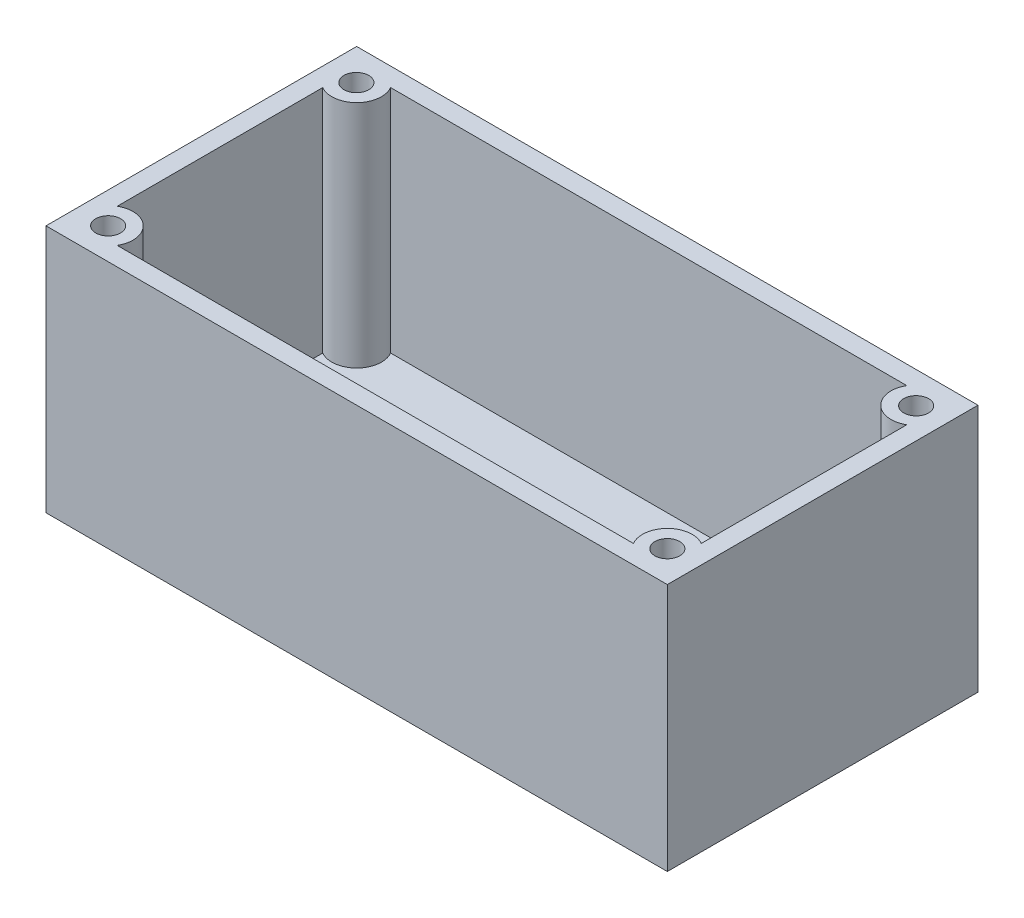
ISO-10303-21;
HEADER;
FILE_DESCRIPTION(('STEP AP214'),'2;1');
FILE_NAME('part.step','',(''),(''),'','','');
FILE_SCHEMA(('AUTOMOTIVE_DESIGN { 1 0 10303 214 1 1 1 1 }'));
ENDSEC;
DATA;
#1=APPLICATION_CONTEXT('core data for automotive mechanical design processes');
#2=APPLICATION_PROTOCOL_DEFINITION('international standard','automotive_design',2000,#1);
#3=PRODUCT_CONTEXT('',#1,'mechanical');
#4=PRODUCT('Part','Part','',(#3));
#5=PRODUCT_RELATED_PRODUCT_CATEGORY('part','',(#4));
#6=PRODUCT_DEFINITION_FORMATION('','',#4);
#7=PRODUCT_DEFINITION_CONTEXT('part definition',#1,'design');
#8=PRODUCT_DEFINITION('design','',#6,#7);
#9=PRODUCT_DEFINITION_SHAPE('','',#8);
#10=(LENGTH_UNIT() NAMED_UNIT(*) SI_UNIT(.MILLI.,.METRE.));
#11=(NAMED_UNIT(*) PLANE_ANGLE_UNIT() SI_UNIT($,.RADIAN.));
#12=(NAMED_UNIT(*) SI_UNIT($,.STERADIAN.) SOLID_ANGLE_UNIT());
#13=UNCERTAINTY_MEASURE_WITH_UNIT(LENGTH_MEASURE(1.E-05),#10,'distance_accuracy_value','');
#14=(GEOMETRIC_REPRESENTATION_CONTEXT(3) GLOBAL_UNCERTAINTY_ASSIGNED_CONTEXT((#13)) GLOBAL_UNIT_ASSIGNED_CONTEXT((#10,
#11,#12)) REPRESENTATION_CONTEXT('',''));
#15=CARTESIAN_POINT('',(0.,0.,0.));
#16=DIRECTION('',(0.,0.,1.));
#17=DIRECTION('',(1.,0.,0.));
#18=AXIS2_PLACEMENT_3D('',#15,#16,#17);
#19=CARTESIAN_POINT('',(0.,20.,-1.5));
#20=DIRECTION('',(0.,0.,-1.));
#21=DIRECTION('',(-1.,0.,0.));
#22=AXIS2_PLACEMENT_3D('',#19,#20,#21);
#23=PLANE('',#22);
#24=DIRECTION('',(1.,0.,0.));
#25=VECTOR('',#24,1.);
#26=CARTESIAN_POINT('',(0.,1.5,-1.5));
#27=LINE('',#26,#25);
#28=CARTESIAN_POINT('',(4.23205080756909,1.5,-1.5));
#29=VERTEX_POINT('',#28);
#30=CARTESIAN_POINT('',(45.7679491924313,1.5,-1.5));
#31=VERTEX_POINT('',#30);
#32=EDGE_CURVE('E251',#29,#31,#27,.T.);
#33=ORIENTED_EDGE('',*,*,#32,.F.);
#34=DIRECTION('',(0.,-1.,0.));
#35=VECTOR('',#34,1.);
#36=CARTESIAN_POINT('',(4.23205080756909,20.,-1.5));
#37=LINE('',#36,#35);
#38=CARTESIAN_POINT('',(4.23205080756909,20.,-1.5));
#39=VERTEX_POINT('',#38);
#40=EDGE_CURVE('E59',#29,#39,#37,.F.);
#41=ORIENTED_EDGE('',*,*,#40,.T.);
#42=DIRECTION('',(1.,0.,0.));
#43=VECTOR('',#42,1.);
#44=CARTESIAN_POINT('',(0.,20.,-1.5));
#45=LINE('',#44,#43);
#46=CARTESIAN_POINT('',(45.7679491924313,20.,-1.5));
#47=VERTEX_POINT('',#46);
#48=EDGE_CURVE('E264',#39,#47,#45,.T.);
#49=ORIENTED_EDGE('',*,*,#48,.T.);
#50=DIRECTION('',(0.,-1.,0.));
#51=VECTOR('',#50,1.);
#52=CARTESIAN_POINT('',(45.7679491924313,20.,-1.5));
#53=LINE('',#52,#51);
#54=EDGE_CURVE('E223',#47,#31,#53,.T.);
#55=ORIENTED_EDGE('',*,*,#54,.T.);
#56=EDGE_LOOP('',(#33,#41,#49,#55));
#57=FACE_BOUND('',#56,.T.);
#58=ADVANCED_FACE('F43',(#57),#23,.T.);
#59=CARTESIAN_POINT('',(1.5,20.,0.));
#60=DIRECTION('',(-1.,0.,0.));
#61=DIRECTION('',(0.,0.,1.));
#62=AXIS2_PLACEMENT_3D('',#59,#60,#61);
#63=PLANE('',#62);
#64=DIRECTION('',(0.,-1.,0.));
#65=VECTOR('',#64,1.);
#66=CARTESIAN_POINT('',(1.5,20.,-4.23205080756876));
#67=LINE('',#66,#65);
#68=CARTESIAN_POINT('',(1.5,1.5,-4.23205080756876));
#69=VERTEX_POINT('',#68);
#70=CARTESIAN_POINT('',(1.5,20.,-4.23205080756876));
#71=VERTEX_POINT('',#70);
#72=EDGE_CURVE('E214',#69,#71,#67,.F.);
#73=ORIENTED_EDGE('',*,*,#72,.F.);
#74=DIRECTION('',(0.,0.,-1.));
#75=VECTOR('',#74,1.);
#76=CARTESIAN_POINT('',(1.5,1.5,0.));
#77=LINE('',#76,#75);
#78=CARTESIAN_POINT('',(1.5,1.5,-20.7679491924311));
#79=VERTEX_POINT('',#78);
#80=EDGE_CURVE('E261',#69,#79,#77,.T.);
#81=ORIENTED_EDGE('',*,*,#80,.T.);
#82=DIRECTION('',(0.,-1.,0.));
#83=VECTOR('',#82,1.);
#84=CARTESIAN_POINT('',(1.5,20.,-20.7679491924311));
#85=LINE('',#84,#83);
#86=CARTESIAN_POINT('',(1.5,20.,-20.7679491924311));
#87=VERTEX_POINT('',#86);
#88=EDGE_CURVE('E244',#87,#79,#85,.T.);
#89=ORIENTED_EDGE('',*,*,#88,.F.);
#90=DIRECTION('',(0.,0.,-1.));
#91=VECTOR('',#90,1.);
#92=CARTESIAN_POINT('',(1.5,20.,0.));
#93=LINE('',#92,#91);
#94=EDGE_CURVE('E274',#71,#87,#93,.T.);
#95=ORIENTED_EDGE('',*,*,#94,.F.);
#96=EDGE_LOOP('',(#73,#81,#89,#95));
#97=FACE_BOUND('',#96,.T.);
#98=ADVANCED_FACE('F359',(#97),#63,.F.);
#99=CARTESIAN_POINT('',(48.5,20.,0.));
#100=DIRECTION('',(-1.,0.,0.));
#101=DIRECTION('',(0.,0.,1.));
#102=AXIS2_PLACEMENT_3D('',#99,#100,#101);
#103=PLANE('',#102);
#104=DIRECTION('',(0.,0.,-1.));
#105=VECTOR('',#104,1.);
#106=CARTESIAN_POINT('',(48.5,1.5,0.));
#107=LINE('',#106,#105);
#108=CARTESIAN_POINT('',(48.5,1.5,-4.232050807569));
#109=VERTEX_POINT('',#108);
#110=CARTESIAN_POINT('',(48.5,1.5,-20.7679491924311));
#111=VERTEX_POINT('',#110);
#112=EDGE_CURVE('E254',#109,#111,#107,.T.);
#113=ORIENTED_EDGE('',*,*,#112,.F.);
#114=DIRECTION('',(0.,-1.,0.));
#115=VECTOR('',#114,1.);
#116=CARTESIAN_POINT('',(48.5,20.,-4.232050807569));
#117=LINE('',#116,#115);
#118=CARTESIAN_POINT('',(48.5,20.,-4.232050807569));
#119=VERTEX_POINT('',#118);
#120=EDGE_CURVE('E66',#109,#119,#117,.F.);
#121=ORIENTED_EDGE('',*,*,#120,.T.);
#122=DIRECTION('',(0.,0.,-1.));
#123=VECTOR('',#122,1.);
#124=CARTESIAN_POINT('',(48.5,20.,0.));
#125=LINE('',#124,#123);
#126=CARTESIAN_POINT('',(48.5,20.,-20.7679491924311));
#127=VERTEX_POINT('',#126);
#128=EDGE_CURVE('E267',#119,#127,#125,.T.);
#129=ORIENTED_EDGE('',*,*,#128,.T.);
#130=DIRECTION('',(0.,-1.,0.));
#131=VECTOR('',#130,1.);
#132=CARTESIAN_POINT('',(48.5,20.,-20.7679491924311));
#133=LINE('',#132,#131);
#134=EDGE_CURVE('E233',#127,#111,#133,.T.);
#135=ORIENTED_EDGE('',*,*,#134,.T.);
#136=EDGE_LOOP('',(#113,#121,#129,#135));
#137=FACE_BOUND('',#136,.T.);
#138=ADVANCED_FACE('F337',(#137),#103,.T.);
#139=CARTESIAN_POINT('',(0.,20.,-23.5));
#140=DIRECTION('',(0.,0.,-1.));
#141=DIRECTION('',(-1.,0.,0.));
#142=AXIS2_PLACEMENT_3D('',#139,#140,#141);
#143=PLANE('',#142);
#144=DIRECTION('',(0.,-1.,0.));
#145=VECTOR('',#144,1.);
#146=CARTESIAN_POINT('',(45.7679491924311,20.,-23.5));
#147=LINE('',#146,#145);
#148=CARTESIAN_POINT('',(45.7679491924311,20.,-23.5));
#149=VERTEX_POINT('',#148);
#150=CARTESIAN_POINT('',(45.7679491924311,1.5,-23.5));
#151=VERTEX_POINT('',#150);
#152=EDGE_CURVE('E237',#149,#151,#147,.T.);
#153=ORIENTED_EDGE('',*,*,#152,.F.);
#154=DIRECTION('',(1.,0.,0.));
#155=VECTOR('',#154,1.);
#156=CARTESIAN_POINT('',(0.,20.,-23.5));
#157=LINE('',#156,#155);
#158=CARTESIAN_POINT('',(4.23205080756888,20.,-23.5));
#159=VERTEX_POINT('',#158);
#160=EDGE_CURVE('E270',#159,#149,#157,.T.);
#161=ORIENTED_EDGE('',*,*,#160,.F.);
#162=DIRECTION('',(0.,-1.,0.));
#163=VECTOR('',#162,1.);
#164=CARTESIAN_POINT('',(4.23205080756888,20.,-23.5));
#165=LINE('',#164,#163);
#166=CARTESIAN_POINT('',(4.23205080756888,1.5,-23.5));
#167=VERTEX_POINT('',#166);
#168=EDGE_CURVE('E248',#167,#159,#165,.F.);
#169=ORIENTED_EDGE('',*,*,#168,.F.);
#170=DIRECTION('',(1.,0.,0.));
#171=VECTOR('',#170,1.);
#172=CARTESIAN_POINT('',(0.,1.5,-23.5));
#173=LINE('',#172,#171);
#174=EDGE_CURVE('E257',#167,#151,#173,.T.);
#175=ORIENTED_EDGE('',*,*,#174,.T.);
#176=EDGE_LOOP('',(#153,#161,#169,#175));
#177=FACE_BOUND('',#176,.T.);
#178=ADVANCED_FACE('F351',(#177),#143,.F.);
#179=CARTESIAN_POINT('',(0.,20.,0.));
#180=DIRECTION('',(0.,0.,-1.));
#181=DIRECTION('',(-1.,0.,0.));
#182=AXIS2_PLACEMENT_3D('',#179,#180,#181);
#183=PLANE('',#182);
#184=DIRECTION('',(1.,0.,0.));
#185=VECTOR('',#184,1.);
#186=CARTESIAN_POINT('',(0.,0.,0.));
#187=LINE('',#186,#185);
#188=CARTESIAN_POINT('',(0.,0.,0.));
#189=VERTEX_POINT('',#188);
#190=CARTESIAN_POINT('',(50.,0.,0.));
#191=VERTEX_POINT('',#190);
#192=EDGE_CURVE('E277',#189,#191,#187,.T.);
#193=ORIENTED_EDGE('',*,*,#192,.T.);
#194=DIRECTION('',(0.,-1.,0.));
#195=VECTOR('',#194,1.);
#196=CARTESIAN_POINT('',(50.,20.,0.));
#197=LINE('',#196,#195);
#198=CARTESIAN_POINT('',(50.,20.,0.));
#199=VERTEX_POINT('',#198);
#200=EDGE_CURVE('E317',#199,#191,#197,.T.);
#201=ORIENTED_EDGE('',*,*,#200,.F.);
#202=DIRECTION('',(1.,0.,0.));
#203=VECTOR('',#202,1.);
#204=CARTESIAN_POINT('',(0.,20.,0.));
#205=LINE('',#204,#203);
#206=CARTESIAN_POINT('',(0.,20.,0.));
#207=VERTEX_POINT('',#206);
#208=EDGE_CURVE('E278',#207,#199,#205,.T.);
#209=ORIENTED_EDGE('',*,*,#208,.F.);
#210=DIRECTION('',(0.,-1.,0.));
#211=VECTOR('',#210,1.);
#212=CARTESIAN_POINT('',(0.,20.,0.));
#213=LINE('',#212,#211);
#214=EDGE_CURVE('E294',#207,#189,#213,.T.);
#215=ORIENTED_EDGE('',*,*,#214,.T.);
#216=EDGE_LOOP('',(#193,#201,#209,#215));
#217=FACE_BOUND('',#216,.T.);
#218=ADVANCED_FACE('F45',(#217),#183,.F.);
#219=CARTESIAN_POINT('',(50.,20.,0.));
#220=DIRECTION('',(-1.,0.,0.));
#221=DIRECTION('',(0.,0.,1.));
#222=AXIS2_PLACEMENT_3D('',#219,#220,#221);
#223=PLANE('',#222);
#224=DIRECTION('',(0.,0.,-1.));
#225=VECTOR('',#224,1.);
#226=CARTESIAN_POINT('',(50.,0.,0.));
#227=LINE('',#226,#225);
#228=CARTESIAN_POINT('',(50.,0.,-25.));
#229=VERTEX_POINT('',#228);
#230=EDGE_CURVE('E298',#191,#229,#227,.T.);
#231=ORIENTED_EDGE('',*,*,#230,.T.);
#232=DIRECTION('',(0.,-1.,0.));
#233=VECTOR('',#232,1.);
#234=CARTESIAN_POINT('',(50.,20.,-25.));
#235=LINE('',#234,#233);
#236=CARTESIAN_POINT('',(50.,20.,-25.));
#237=VERTEX_POINT('',#236);
#238=EDGE_CURVE('E314',#237,#229,#235,.T.);
#239=ORIENTED_EDGE('',*,*,#238,.F.);
#240=DIRECTION('',(0.,0.,-1.));
#241=VECTOR('',#240,1.);
#242=CARTESIAN_POINT('',(50.,20.,0.));
#243=LINE('',#242,#241);
#244=EDGE_CURVE('E282',#199,#237,#243,.T.);
#245=ORIENTED_EDGE('',*,*,#244,.F.);
#246=ORIENTED_EDGE('',*,*,#200,.T.);
#247=EDGE_LOOP('',(#231,#239,#245,#246));
#248=FACE_BOUND('',#247,.T.);
#249=ADVANCED_FACE('F399',(#248),#223,.F.);
#250=CARTESIAN_POINT('',(0.,20.,-25.));
#251=DIRECTION('',(0.,0.,-1.));
#252=DIRECTION('',(-1.,0.,0.));
#253=AXIS2_PLACEMENT_3D('',#250,#251,#252);
#254=PLANE('',#253);
#255=DIRECTION('',(1.,0.,0.));
#256=VECTOR('',#255,1.);
#257=CARTESIAN_POINT('',(0.,0.,-25.));
#258=LINE('',#257,#256);
#259=CARTESIAN_POINT('',(0.,0.,-25.));
#260=VERTEX_POINT('',#259);
#261=EDGE_CURVE('E302',#260,#229,#258,.T.);
#262=ORIENTED_EDGE('',*,*,#261,.F.);
#263=DIRECTION('',(0.,-1.,0.));
#264=VECTOR('',#263,1.);
#265=CARTESIAN_POINT('',(0.,20.,-25.));
#266=LINE('',#265,#264);
#267=CARTESIAN_POINT('',(0.,20.,-25.));
#268=VERTEX_POINT('',#267);
#269=EDGE_CURVE('E311',#268,#260,#266,.T.);
#270=ORIENTED_EDGE('',*,*,#269,.F.);
#271=DIRECTION('',(1.,0.,0.));
#272=VECTOR('',#271,1.);
#273=CARTESIAN_POINT('',(0.,20.,-25.));
#274=LINE('',#273,#272);
#275=EDGE_CURVE('E286',#268,#237,#274,.T.);
#276=ORIENTED_EDGE('',*,*,#275,.T.);
#277=ORIENTED_EDGE('',*,*,#238,.T.);
#278=EDGE_LOOP('',(#262,#270,#276,#277));
#279=FACE_BOUND('',#278,.T.);
#280=ADVANCED_FACE('F396',(#279),#254,.T.);
#281=CARTESIAN_POINT('',(0.,20.,0.));
#282=DIRECTION('',(-1.,0.,0.));
#283=DIRECTION('',(0.,0.,1.));
#284=AXIS2_PLACEMENT_3D('',#281,#282,#283);
#285=PLANE('',#284);
#286=DIRECTION('',(0.,0.,-1.));
#287=VECTOR('',#286,1.);
#288=CARTESIAN_POINT('',(0.,0.,0.));
#289=LINE('',#288,#287);
#290=EDGE_CURVE('E283',#189,#260,#289,.T.);
#291=ORIENTED_EDGE('',*,*,#290,.F.);
#292=ORIENTED_EDGE('',*,*,#214,.F.);
#293=DIRECTION('',(0.,0.,-1.));
#294=VECTOR('',#293,1.);
#295=CARTESIAN_POINT('',(0.,20.,0.));
#296=LINE('',#295,#294);
#297=EDGE_CURVE('E290',#207,#268,#296,.T.);
#298=ORIENTED_EDGE('',*,*,#297,.T.);
#299=ORIENTED_EDGE('',*,*,#269,.T.);
#300=EDGE_LOOP('',(#291,#292,#298,#299));
#301=FACE_BOUND('',#300,.T.);
#302=ADVANCED_FACE('F389',(#301),#285,.T.);
#303=CARTESIAN_POINT('',(0.,20.,0.));
#304=DIRECTION('',(0.,1.,0.));
#305=DIRECTION('',(0.,0.,1.));
#306=AXIS2_PLACEMENT_3D('',#303,#304,#305);
#307=PLANE('',#306);
#308=CARTESIAN_POINT('',(47.5532544339654,20.,-22.4717543760268));
#309=DIRECTION('',(0.,1.,0.));
#310=DIRECTION('',(0.,0.,1.));
#311=AXIS2_PLACEMENT_3D('',#308,#309,#310);
#312=CIRCLE('',#311,1.);
#313=CARTESIAN_POINT('',(47.5532544339654,20.,-21.4717543760268));
#314=VERTEX_POINT('',#313);
#315=EDGE_CURVE('E655',#314,#314,#312,.T.);
#316=ORIENTED_EDGE('',*,*,#315,.F.);
#317=EDGE_LOOP('',(#316));
#318=FACE_BOUND('',#317,.T.);
#319=CARTESIAN_POINT('',(47.5000000000002,20.,-2.5));
#320=DIRECTION('',(0.,1.,0.));
#321=DIRECTION('',(0.,0.,1.));
#322=AXIS2_PLACEMENT_3D('',#319,#320,#321);
#323=CIRCLE('',#322,1.);
#324=CARTESIAN_POINT('',(47.5000000000002,20.,-1.5));
#325=VERTEX_POINT('',#324);
#326=EDGE_CURVE('E154',#325,#325,#323,.T.);
#327=ORIENTED_EDGE('',*,*,#326,.F.);
#328=EDGE_LOOP('',(#327));
#329=FACE_BOUND('',#328,.T.);
#330=CARTESIAN_POINT('',(2.50364845205643,20.,-22.4717543760268));
#331=DIRECTION('',(0.,1.,0.));
#332=DIRECTION('',(0.,0.,1.));
#333=AXIS2_PLACEMENT_3D('',#330,#331,#332);
#334=CIRCLE('',#333,1.);
#335=CARTESIAN_POINT('',(2.50364845205643,20.,-21.4717543760268));
#336=VERTEX_POINT('',#335);
#337=EDGE_CURVE('E178',#336,#336,#334,.T.);
#338=ORIENTED_EDGE('',*,*,#337,.F.);
#339=EDGE_LOOP('',(#338));
#340=FACE_BOUND('',#339,.T.);
#341=CARTESIAN_POINT('',(2.50000000000021,20.,-2.5));
#342=DIRECTION('',(0.,1.,0.));
#343=DIRECTION('',(0.,0.,1.));
#344=AXIS2_PLACEMENT_3D('',#341,#342,#343);
#345=CIRCLE('',#344,1.);
#346=CARTESIAN_POINT('',(2.50000000000021,20.,-1.5));
#347=VERTEX_POINT('',#346);
#348=EDGE_CURVE('E194',#347,#347,#345,.T.);
#349=ORIENTED_EDGE('',*,*,#348,.F.);
#350=EDGE_LOOP('',(#349));
#351=FACE_BOUND('',#350,.T.);
#352=ORIENTED_EDGE('',*,*,#48,.F.);
#353=CARTESIAN_POINT('',(2.50000000000021,20.,-2.5));
#354=DIRECTION('',(0.,1.,0.));
#355=DIRECTION('',(0.,0.,1.));
#356=AXIS2_PLACEMENT_3D('',#353,#354,#355);
#357=CIRCLE('',#356,2.);
#358=EDGE_CURVE('E210',#39,#71,#357,.T.);
#359=ORIENTED_EDGE('',*,*,#358,.T.);
#360=ORIENTED_EDGE('',*,*,#94,.T.);
#361=CARTESIAN_POINT('',(2.5,20.,-22.5));
#362=DIRECTION('',(0.,1.,0.));
#363=DIRECTION('',(0.,0.,1.));
#364=AXIS2_PLACEMENT_3D('',#361,#362,#363);
#365=CIRCLE('',#364,2.);
#366=EDGE_CURVE('E240',#87,#159,#365,.T.);
#367=ORIENTED_EDGE('',*,*,#366,.T.);
#368=ORIENTED_EDGE('',*,*,#160,.T.);
#369=CARTESIAN_POINT('',(47.5,20.,-22.5));
#370=DIRECTION('',(0.,1.,0.));
#371=DIRECTION('',(0.,0.,1.));
#372=AXIS2_PLACEMENT_3D('',#369,#370,#371);
#373=CIRCLE('',#372,2.);
#374=EDGE_CURVE('E229',#149,#127,#373,.T.);
#375=ORIENTED_EDGE('',*,*,#374,.T.);
#376=ORIENTED_EDGE('',*,*,#128,.F.);
#377=CARTESIAN_POINT('',(47.5000000000002,20.,-2.5));
#378=DIRECTION('',(0.,1.,0.));
#379=DIRECTION('',(0.,0.,1.));
#380=AXIS2_PLACEMENT_3D('',#377,#378,#379);
#381=CIRCLE('',#380,2.);
#382=EDGE_CURVE('E219',#119,#47,#381,.T.);
#383=ORIENTED_EDGE('',*,*,#382,.T.);
#384=EDGE_LOOP('',(#352,#359,#360,#367,#368,#375,#376,#383));
#385=FACE_BOUND('',#384,.T.);
#386=ORIENTED_EDGE('',*,*,#208,.T.);
#387=ORIENTED_EDGE('',*,*,#244,.T.);
#388=ORIENTED_EDGE('',*,*,#275,.F.);
#389=ORIENTED_EDGE('',*,*,#297,.F.);
#390=EDGE_LOOP('',(#386,#387,#388,#389));
#391=FACE_BOUND('',#390,.T.);
#392=ADVANCED_FACE('F345',(#318,#329,#340,#351,#385,#391),#307,.T.);
#393=CARTESIAN_POINT('',(0.,0.,0.));
#394=DIRECTION('',(0.,1.,0.));
#395=DIRECTION('',(0.,0.,1.));
#396=AXIS2_PLACEMENT_3D('',#393,#394,#395);
#397=PLANE('',#396);
#398=ORIENTED_EDGE('',*,*,#192,.F.);
#399=ORIENTED_EDGE('',*,*,#290,.T.);
#400=ORIENTED_EDGE('',*,*,#261,.T.);
#401=ORIENTED_EDGE('',*,*,#230,.F.);
#402=EDGE_LOOP('',(#398,#399,#400,#401));
#403=FACE_BOUND('',#402,.T.);
#404=ADVANCED_FACE('F386',(#403),#397,.F.);
#405=CARTESIAN_POINT('',(0.,1.5,0.));
#406=DIRECTION('',(0.,1.,0.));
#407=DIRECTION('',(0.,0.,1.));
#408=AXIS2_PLACEMENT_3D('',#405,#406,#407);
#409=PLANE('',#408);
#410=ORIENTED_EDGE('',*,*,#80,.F.);
#411=CARTESIAN_POINT('',(2.50000000000021,1.5,-2.5));
#412=DIRECTION('',(0.,1.,0.));
#413=DIRECTION('',(0.,0.,1.));
#414=AXIS2_PLACEMENT_3D('',#411,#412,#413);
#415=CIRCLE('',#414,2.);
#416=EDGE_CURVE('E11',#69,#29,#415,.F.);
#417=ORIENTED_EDGE('',*,*,#416,.T.);
#418=ORIENTED_EDGE('',*,*,#32,.T.);
#419=CARTESIAN_POINT('',(47.5000000000002,1.5,-2.5));
#420=DIRECTION('',(0.,1.,0.));
#421=DIRECTION('',(0.,0.,1.));
#422=AXIS2_PLACEMENT_3D('',#419,#420,#421);
#423=CIRCLE('',#422,2.);
#424=EDGE_CURVE('E52',#31,#109,#423,.F.);
#425=ORIENTED_EDGE('',*,*,#424,.T.);
#426=ORIENTED_EDGE('',*,*,#112,.T.);
#427=CARTESIAN_POINT('',(47.5,1.5,-22.5));
#428=DIRECTION('',(0.,1.,0.));
#429=DIRECTION('',(0.,0.,1.));
#430=AXIS2_PLACEMENT_3D('',#427,#428,#429);
#431=CIRCLE('',#430,2.);
#432=EDGE_CURVE('E325',#111,#151,#431,.F.);
#433=ORIENTED_EDGE('',*,*,#432,.T.);
#434=ORIENTED_EDGE('',*,*,#174,.F.);
#435=CARTESIAN_POINT('',(2.5,1.5,-22.5));
#436=DIRECTION('',(0.,1.,0.));
#437=DIRECTION('',(0.,0.,1.));
#438=AXIS2_PLACEMENT_3D('',#435,#436,#437);
#439=CIRCLE('',#438,2.);
#440=EDGE_CURVE('E321',#167,#79,#439,.F.);
#441=ORIENTED_EDGE('',*,*,#440,.T.);
#442=EDGE_LOOP('',(#410,#417,#418,#425,#426,#433,#434,#441));
#443=FACE_BOUND('',#442,.T.);
#444=ADVANCED_FACE('F332',(#443),#409,.T.);
#445=CARTESIAN_POINT('',(2.5,20.,-22.5));
#446=DIRECTION('',(0.,-1.,0.));
#447=DIRECTION('',(0.,0.,-1.));
#448=AXIS2_PLACEMENT_3D('',#445,#446,#447);
#449=CYLINDRICAL_SURFACE('',#448,2.);
#450=ORIENTED_EDGE('',*,*,#440,.F.);
#451=ORIENTED_EDGE('',*,*,#168,.T.);
#452=ORIENTED_EDGE('',*,*,#366,.F.);
#453=ORIENTED_EDGE('',*,*,#88,.T.);
#454=EDGE_LOOP('',(#450,#451,#452,#453));
#455=FACE_BOUND('',#454,.T.);
#456=ADVANCED_FACE('F354',(#455),#449,.T.);
#457=CARTESIAN_POINT('',(47.5,20.,-22.5));
#458=DIRECTION('',(0.,-1.,0.));
#459=DIRECTION('',(0.,0.,-1.));
#460=AXIS2_PLACEMENT_3D('',#457,#458,#459);
#461=CYLINDRICAL_SURFACE('',#460,2.);
#462=ORIENTED_EDGE('',*,*,#374,.F.);
#463=ORIENTED_EDGE('',*,*,#152,.T.);
#464=ORIENTED_EDGE('',*,*,#432,.F.);
#465=ORIENTED_EDGE('',*,*,#134,.F.);
#466=EDGE_LOOP('',(#462,#463,#464,#465));
#467=FACE_BOUND('',#466,.T.);
#468=ADVANCED_FACE('F341',(#467),#461,.T.);
#469=CARTESIAN_POINT('',(47.5000000000002,20.,-2.5));
#470=DIRECTION('',(0.,-1.,0.));
#471=DIRECTION('',(0.,0.,-1.));
#472=AXIS2_PLACEMENT_3D('',#469,#470,#471);
#473=CYLINDRICAL_SURFACE('',#472,2.);
#474=ORIENTED_EDGE('',*,*,#120,.F.);
#475=ORIENTED_EDGE('',*,*,#424,.F.);
#476=ORIENTED_EDGE('',*,*,#54,.F.);
#477=ORIENTED_EDGE('',*,*,#382,.F.);
#478=EDGE_LOOP('',(#474,#475,#476,#477));
#479=FACE_BOUND('',#478,.T.);
#480=ADVANCED_FACE('F362',(#479),#473,.T.);
#481=CARTESIAN_POINT('',(2.50000000000021,20.,-2.5));
#482=DIRECTION('',(0.,-1.,0.));
#483=DIRECTION('',(0.,0.,-1.));
#484=AXIS2_PLACEMENT_3D('',#481,#482,#483);
#485=CYLINDRICAL_SURFACE('',#484,2.);
#486=ORIENTED_EDGE('',*,*,#40,.F.);
#487=ORIENTED_EDGE('',*,*,#416,.F.);
#488=ORIENTED_EDGE('',*,*,#72,.T.);
#489=ORIENTED_EDGE('',*,*,#358,.F.);
#490=EDGE_LOOP('',(#486,#487,#488,#489));
#491=FACE_BOUND('',#490,.T.);
#492=ADVANCED_FACE('F360',(#491),#485,.T.);
#493=CARTESIAN_POINT('',(2.50000000000021,12.,-2.5));
#494=DIRECTION('',(0.,1.,0.));
#495=DIRECTION('',(0.,0.,1.));
#496=AXIS2_PLACEMENT_3D('',#493,#494,#495);
#497=CONICAL_SURFACE('',#496,0.799999999999998,1.02974425867665);
#498=CARTESIAN_POINT('',(2.50000000000021,11.519311504778,-2.5));
#499=VERTEX_POINT('',#498);
#500=VERTEX_LOOP('',#499);
#501=FACE_BOUND('',#500,.T.);
#502=CARTESIAN_POINT('',(2.50000000000021,12.,-2.5));
#503=DIRECTION('',(0.,1.,0.));
#504=DIRECTION('',(0.,0.,1.));
#505=AXIS2_PLACEMENT_3D('',#502,#503,#504);
#506=CIRCLE('',#505,0.799999999999998);
#507=CARTESIAN_POINT('',(2.50000000000021,12.,-1.7));
#508=VERTEX_POINT('',#507);
#509=EDGE_CURVE('E206',#508,#508,#506,.T.);
#510=ORIENTED_EDGE('',*,*,#509,.T.);
#511=EDGE_LOOP('',(#510));
#512=FACE_BOUND('',#511,.T.);
#513=ADVANCED_FACE('F369',(#501,#512),#497,.F.);
#514=CARTESIAN_POINT('',(2.50000000000021,20.,-2.5));
#515=DIRECTION('',(0.,1.,0.));
#516=DIRECTION('',(0.,0.,1.));
#517=AXIS2_PLACEMENT_3D('',#514,#515,#516);
#518=CYLINDRICAL_SURFACE('',#517,0.799999999999998);
#519=ORIENTED_EDGE('',*,*,#509,.F.);
#520=EDGE_LOOP('',(#519));
#521=FACE_BOUND('',#520,.T.);
#522=CARTESIAN_POINT('',(2.50000000000021,16.,-2.5));
#523=DIRECTION('',(0.,1.,0.));
#524=DIRECTION('',(0.,0.,1.));
#525=AXIS2_PLACEMENT_3D('',#522,#523,#524);
#526=CIRCLE('',#525,0.799999999999999);
#527=CARTESIAN_POINT('',(2.50000000000021,16.,-1.7));
#528=VERTEX_POINT('',#527);
#529=EDGE_CURVE('E202',#528,#528,#526,.T.);
#530=ORIENTED_EDGE('',*,*,#529,.T.);
#531=EDGE_LOOP('',(#530));
#532=FACE_BOUND('',#531,.T.);
#533=ADVANCED_FACE('F495',(#521,#532),#518,.F.);
#534=CARTESIAN_POINT('',(3.30000000000021,16.,-2.5));
#535=DIRECTION('',(0.,-1.,0.));
#536=DIRECTION('',(0.,0.,-1.));
#537=AXIS2_PLACEMENT_3D('',#534,#535,#536);
#538=PLANE('',#537);
#539=ORIENTED_EDGE('',*,*,#529,.F.);
#540=EDGE_LOOP('',(#539));
#541=FACE_BOUND('',#540,.T.);
#542=CARTESIAN_POINT('',(2.50000000000021,16.,-2.5));
#543=DIRECTION('',(0.,1.,0.));
#544=DIRECTION('',(0.,0.,1.));
#545=AXIS2_PLACEMENT_3D('',#542,#543,#544);
#546=CIRCLE('',#545,0.999999999999999);
#547=CARTESIAN_POINT('',(2.50000000000021,16.,-1.5));
#548=VERTEX_POINT('',#547);
#549=EDGE_CURVE('E198',#548,#548,#546,.T.);
#550=ORIENTED_EDGE('',*,*,#549,.T.);
#551=EDGE_LOOP('',(#550));
#552=FACE_BOUND('',#551,.T.);
#553=ADVANCED_FACE('F502',(#541,#552),#538,.F.);
#554=CARTESIAN_POINT('',(2.50000000000021,20.,-2.5));
#555=DIRECTION('',(0.,1.,0.));
#556=DIRECTION('',(0.,0.,1.));
#557=AXIS2_PLACEMENT_3D('',#554,#555,#556);
#558=CYLINDRICAL_SURFACE('',#557,0.999999999999999);
#559=ORIENTED_EDGE('',*,*,#549,.F.);
#560=EDGE_LOOP('',(#559));
#561=FACE_BOUND('',#560,.T.);
#562=ORIENTED_EDGE('',*,*,#348,.T.);
#563=EDGE_LOOP('',(#562));
#564=FACE_BOUND('',#563,.T.);
#565=ADVANCED_FACE('F510',(#561,#564),#558,.F.);
#566=CARTESIAN_POINT('',(2.50364845205643,12.,-22.4717543760268));
#567=DIRECTION('',(0.,1.,0.));
#568=DIRECTION('',(0.,0.,1.));
#569=AXIS2_PLACEMENT_3D('',#566,#567,#568);
#570=CONICAL_SURFACE('',#569,0.799999999999998,1.02974425867665);
#571=CARTESIAN_POINT('',(2.50364845205643,11.519311504778,-22.4717543760268));
#572=VERTEX_POINT('',#571);
#573=VERTEX_LOOP('',#572);
#574=FACE_BOUND('',#573,.T.);
#575=CARTESIAN_POINT('',(2.50364845205643,12.,-22.4717543760268));
#576=DIRECTION('',(0.,1.,0.));
#577=DIRECTION('',(0.,0.,1.));
#578=AXIS2_PLACEMENT_3D('',#575,#576,#577);
#579=CIRCLE('',#578,0.799999999999998);
#580=CARTESIAN_POINT('',(2.50364845205643,12.,-21.6717543760268));
#581=VERTEX_POINT('',#580);
#582=EDGE_CURVE('E190',#581,#581,#579,.T.);
#583=ORIENTED_EDGE('',*,*,#582,.T.);
#584=EDGE_LOOP('',(#583));
#585=FACE_BOUND('',#584,.T.);
#586=ADVANCED_FACE('F519',(#574,#585),#570,.F.);
#587=CARTESIAN_POINT('',(2.50364845205643,20.,-22.4717543760268));
#588=DIRECTION('',(0.,1.,0.));
#589=DIRECTION('',(0.,0.,1.));
#590=AXIS2_PLACEMENT_3D('',#587,#588,#589);
#591=CYLINDRICAL_SURFACE('',#590,0.799999999999998);
#592=ORIENTED_EDGE('',*,*,#582,.F.);
#593=EDGE_LOOP('',(#592));
#594=FACE_BOUND('',#593,.T.);
#595=CARTESIAN_POINT('',(2.50364845205643,16.,-22.4717543760268));
#596=DIRECTION('',(0.,1.,0.));
#597=DIRECTION('',(0.,0.,1.));
#598=AXIS2_PLACEMENT_3D('',#595,#596,#597);
#599=CIRCLE('',#598,0.799999999999999);
#600=CARTESIAN_POINT('',(2.50364845205643,16.,-21.6717543760268));
#601=VERTEX_POINT('',#600);
#602=EDGE_CURVE('E186',#601,#601,#599,.T.);
#603=ORIENTED_EDGE('',*,*,#602,.T.);
#604=EDGE_LOOP('',(#603));
#605=FACE_BOUND('',#604,.T.);
#606=ADVANCED_FACE('F527',(#594,#605),#591,.F.);
#607=CARTESIAN_POINT('',(3.30364845205643,16.,-22.4717543760268));
#608=DIRECTION('',(0.,-1.,0.));
#609=DIRECTION('',(0.,0.,-1.));
#610=AXIS2_PLACEMENT_3D('',#607,#608,#609);
#611=PLANE('',#610);
#612=ORIENTED_EDGE('',*,*,#602,.F.);
#613=EDGE_LOOP('',(#612));
#614=FACE_BOUND('',#613,.T.);
#615=CARTESIAN_POINT('',(2.50364845205643,16.,-22.4717543760268));
#616=DIRECTION('',(0.,1.,0.));
#617=DIRECTION('',(0.,0.,1.));
#618=AXIS2_PLACEMENT_3D('',#615,#616,#617);
#619=CIRCLE('',#618,0.999999999999999);
#620=CARTESIAN_POINT('',(2.50364845205643,16.,-21.4717543760268));
#621=VERTEX_POINT('',#620);
#622=EDGE_CURVE('E182',#621,#621,#619,.T.);
#623=ORIENTED_EDGE('',*,*,#622,.T.);
#624=EDGE_LOOP('',(#623));
#625=FACE_BOUND('',#624,.T.);
#626=ADVANCED_FACE('F535',(#614,#625),#611,.F.);
#627=CARTESIAN_POINT('',(2.50364845205643,20.,-22.4717543760268));
#628=DIRECTION('',(0.,1.,0.));
#629=DIRECTION('',(0.,0.,1.));
#630=AXIS2_PLACEMENT_3D('',#627,#628,#629);
#631=CYLINDRICAL_SURFACE('',#630,0.999999999999999);
#632=ORIENTED_EDGE('',*,*,#622,.F.);
#633=EDGE_LOOP('',(#632));
#634=FACE_BOUND('',#633,.T.);
#635=ORIENTED_EDGE('',*,*,#337,.T.);
#636=EDGE_LOOP('',(#635));
#637=FACE_BOUND('',#636,.T.);
#638=ADVANCED_FACE('F543',(#634,#637),#631,.F.);
#639=CARTESIAN_POINT('',(47.5000000000002,12.,-2.5));
#640=DIRECTION('',(0.,1.,0.));
#641=DIRECTION('',(0.,0.,1.));
#642=AXIS2_PLACEMENT_3D('',#639,#640,#641);
#643=CONICAL_SURFACE('',#642,0.799999999999995,1.02974425867665);
#644=CARTESIAN_POINT('',(47.5000000000002,11.519311504778,-2.5));
#645=VERTEX_POINT('',#644);
#646=VERTEX_LOOP('',#645);
#647=FACE_BOUND('',#646,.T.);
#648=CARTESIAN_POINT('',(47.5000000000002,12.,-2.5));
#649=DIRECTION('',(0.,1.,0.));
#650=DIRECTION('',(0.,0.,1.));
#651=AXIS2_PLACEMENT_3D('',#648,#649,#650);
#652=CIRCLE('',#651,0.799999999999995);
#653=CARTESIAN_POINT('',(47.5000000000002,12.,-1.70000000000001));
#654=VERTEX_POINT('',#653);
#655=EDGE_CURVE('E174',#654,#654,#652,.T.);
#656=ORIENTED_EDGE('',*,*,#655,.T.);
#657=EDGE_LOOP('',(#656));
#658=FACE_BOUND('',#657,.T.);
#659=ADVANCED_FACE('F551',(#647,#658),#643,.F.);
#660=CARTESIAN_POINT('',(47.5000000000002,20.,-2.5));
#661=DIRECTION('',(0.,1.,0.));
#662=DIRECTION('',(0.,0.,1.));
#663=AXIS2_PLACEMENT_3D('',#660,#661,#662);
#664=CYLINDRICAL_SURFACE('',#663,0.799999999999995);
#665=ORIENTED_EDGE('',*,*,#655,.F.);
#666=EDGE_LOOP('',(#665));
#667=FACE_BOUND('',#666,.T.);
#668=CARTESIAN_POINT('',(47.5000000000002,16.,-2.5));
#669=DIRECTION('',(0.,1.,0.));
#670=DIRECTION('',(0.,0.,1.));
#671=AXIS2_PLACEMENT_3D('',#668,#669,#670);
#672=CIRCLE('',#671,0.799999999999995);
#673=CARTESIAN_POINT('',(47.5000000000002,16.,-1.70000000000001));
#674=VERTEX_POINT('',#673);
#675=EDGE_CURVE('E170',#674,#674,#672,.T.);
#676=ORIENTED_EDGE('',*,*,#675,.T.);
#677=EDGE_LOOP('',(#676));
#678=FACE_BOUND('',#677,.T.);
#679=ADVANCED_FACE('F559',(#667,#678),#664,.F.);
#680=CARTESIAN_POINT('',(48.3000000000002,16.,-2.5));
#681=DIRECTION('',(0.,-1.,0.));
#682=DIRECTION('',(0.,0.,-1.));
#683=AXIS2_PLACEMENT_3D('',#680,#681,#682);
#684=PLANE('',#683);
#685=ORIENTED_EDGE('',*,*,#675,.F.);
#686=EDGE_LOOP('',(#685));
#687=FACE_BOUND('',#686,.T.);
#688=CARTESIAN_POINT('',(47.5000000000002,16.,-2.5));
#689=DIRECTION('',(0.,1.,0.));
#690=DIRECTION('',(0.,0.,1.));
#691=AXIS2_PLACEMENT_3D('',#688,#689,#690);
#692=CIRCLE('',#691,1.);
#693=CARTESIAN_POINT('',(47.5000000000002,16.,-1.5));
#694=VERTEX_POINT('',#693);
#695=EDGE_CURVE('E160',#694,#694,#692,.T.);
#696=ORIENTED_EDGE('',*,*,#695,.T.);
#697=EDGE_LOOP('',(#696));
#698=FACE_BOUND('',#697,.T.);
#699=ADVANCED_FACE('F567',(#687,#698),#684,.F.);
#700=CARTESIAN_POINT('',(47.5000000000002,20.,-2.5));
#701=DIRECTION('',(0.,1.,0.));
#702=DIRECTION('',(0.,0.,1.));
#703=AXIS2_PLACEMENT_3D('',#700,#701,#702);
#704=CYLINDRICAL_SURFACE('',#703,1.);
#705=ORIENTED_EDGE('',*,*,#695,.F.);
#706=EDGE_LOOP('',(#705));
#707=FACE_BOUND('',#706,.T.);
#708=ORIENTED_EDGE('',*,*,#326,.T.);
#709=EDGE_LOOP('',(#708));
#710=FACE_BOUND('',#709,.T.);
#711=ADVANCED_FACE('F147',(#707,#710),#704,.F.);
#712=CARTESIAN_POINT('',(47.5532544339654,12.,-22.4717543760268));
#713=DIRECTION('',(0.,1.,0.));
#714=DIRECTION('',(0.,0.,1.));
#715=AXIS2_PLACEMENT_3D('',#712,#713,#714);
#716=CONICAL_SURFACE('',#715,0.799999999999995,1.02974425867665);
#717=CARTESIAN_POINT('',(47.5532544339654,11.519311504778,-22.4717543760268));
#718=VERTEX_POINT('',#717);
#719=VERTEX_LOOP('',#718);
#720=FACE_BOUND('',#719,.T.);
#721=CARTESIAN_POINT('',(47.5532544339654,12.,-22.4717543760268));
#722=DIRECTION('',(0.,1.,0.));
#723=DIRECTION('',(0.,0.,1.));
#724=AXIS2_PLACEMENT_3D('',#721,#722,#723);
#725=CIRCLE('',#724,0.799999999999995);
#726=CARTESIAN_POINT('',(47.5532544339654,12.,-21.6717543760268));
#727=VERTEX_POINT('',#726);
#728=EDGE_CURVE('E151',#727,#727,#725,.T.);
#729=ORIENTED_EDGE('',*,*,#728,.T.);
#730=EDGE_LOOP('',(#729));
#731=FACE_BOUND('',#730,.T.);
#732=ADVANCED_FACE('F143',(#720,#731),#716,.F.);
#733=CARTESIAN_POINT('',(47.5532544339654,20.,-22.4717543760268));
#734=DIRECTION('',(0.,1.,0.));
#735=DIRECTION('',(0.,0.,1.));
#736=AXIS2_PLACEMENT_3D('',#733,#734,#735);
#737=CYLINDRICAL_SURFACE('',#736,0.799999999999995);
#738=ORIENTED_EDGE('',*,*,#728,.F.);
#739=EDGE_LOOP('',(#738));
#740=FACE_BOUND('',#739,.T.);
#741=CARTESIAN_POINT('',(47.5532544339654,16.,-22.4717543760268));
#742=DIRECTION('',(0.,1.,0.));
#743=DIRECTION('',(0.,0.,1.));
#744=AXIS2_PLACEMENT_3D('',#741,#742,#743);
#745=CIRCLE('',#744,0.799999999999995);
#746=CARTESIAN_POINT('',(47.5532544339654,16.,-21.6717543760268));
#747=VERTEX_POINT('',#746);
#748=EDGE_CURVE('E155',#747,#747,#745,.T.);
#749=ORIENTED_EDGE('',*,*,#748,.T.);
#750=EDGE_LOOP('',(#749));
#751=FACE_BOUND('',#750,.T.);
#752=ADVANCED_FACE('F146',(#740,#751),#737,.F.);
#753=CARTESIAN_POINT('',(48.3532544339654,16.,-22.4717543760268));
#754=DIRECTION('',(0.,-1.,0.));
#755=DIRECTION('',(0.,0.,-1.));
#756=AXIS2_PLACEMENT_3D('',#753,#754,#755);
#757=PLANE('',#756);
#758=ORIENTED_EDGE('',*,*,#748,.F.);
#759=EDGE_LOOP('',(#758));
#760=FACE_BOUND('',#759,.T.);
#761=CARTESIAN_POINT('',(47.5532544339654,16.,-22.4717543760268));
#762=DIRECTION('',(0.,1.,0.));
#763=DIRECTION('',(0.,0.,1.));
#764=AXIS2_PLACEMENT_3D('',#761,#762,#763);
#765=CIRCLE('',#764,1.);
#766=CARTESIAN_POINT('',(47.5532544339654,16.,-21.4717543760268));
#767=VERTEX_POINT('',#766);
#768=EDGE_CURVE('E163',#767,#767,#765,.T.);
#769=ORIENTED_EDGE('',*,*,#768,.T.);
#770=EDGE_LOOP('',(#769));
#771=FACE_BOUND('',#770,.T.);
#772=ADVANCED_FACE('F593',(#760,#771),#757,.F.);
#773=CARTESIAN_POINT('',(47.5532544339654,20.,-22.4717543760268));
#774=DIRECTION('',(0.,1.,0.));
#775=DIRECTION('',(0.,0.,1.));
#776=AXIS2_PLACEMENT_3D('',#773,#774,#775);
#777=CYLINDRICAL_SURFACE('',#776,1.);
#778=ORIENTED_EDGE('',*,*,#768,.F.);
#779=EDGE_LOOP('',(#778));
#780=FACE_BOUND('',#779,.T.);
#781=ORIENTED_EDGE('',*,*,#315,.T.);
#782=EDGE_LOOP('',(#781));
#783=FACE_BOUND('',#782,.T.);
#784=ADVANCED_FACE('F600',(#780,#783),#777,.F.);
#785=CLOSED_SHELL('',(#58,#98,#138,#178,#218,#249,#280,#302,#392,#404,#444,#456,#468,#480,#492,
#513,#533,#553,#565,#586,#606,#626,#638,#659,#679,#699,#711,#732,#752,#772,#784));
#786=MANIFOLD_SOLID_BREP('B2',#785);
#787=ADVANCED_BREP_SHAPE_REPRESENTATION('',(#18,#786),#14);
#788=SHAPE_DEFINITION_REPRESENTATION(#9,#787);
ENDSEC;
END-ISO-10303-21;
